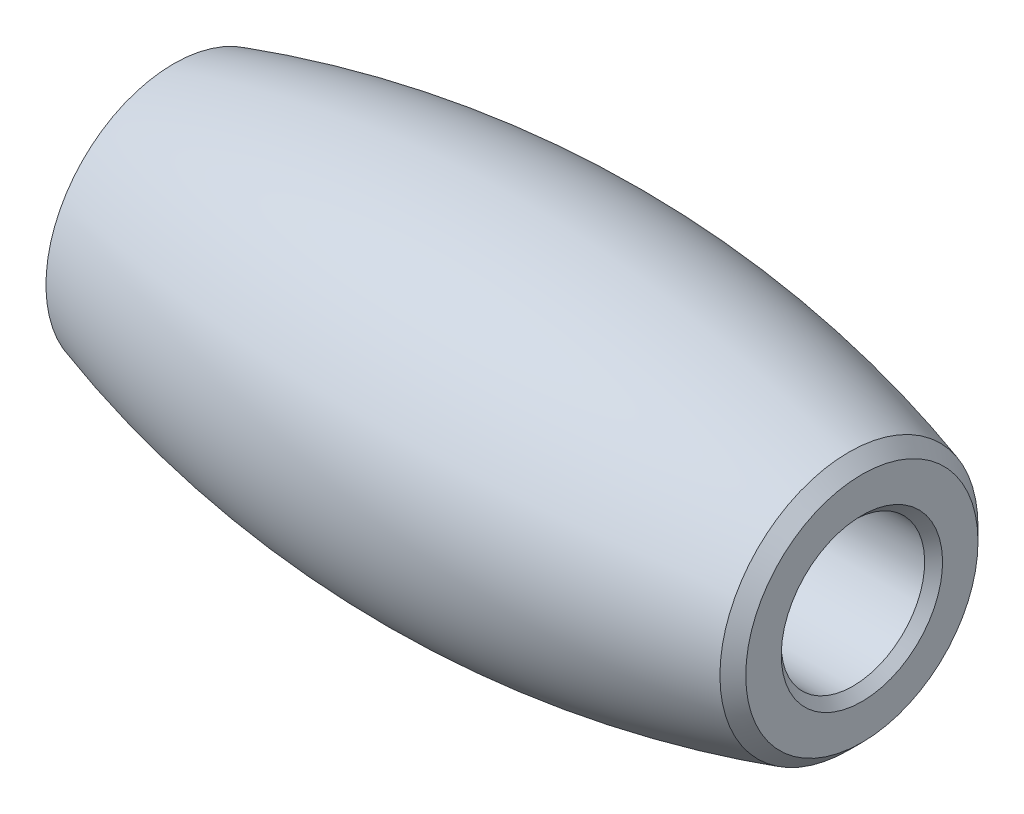
ISO-10303-21;
HEADER;
FILE_DESCRIPTION(('STEP AP214'),'2;1');
FILE_NAME('part.step','',(''),(''),'','','');
FILE_SCHEMA(('AUTOMOTIVE_DESIGN { 1 0 10303 214 1 1 1 1 }'));
ENDSEC;
DATA;
#1=APPLICATION_CONTEXT('core data for automotive mechanical design processes');
#2=APPLICATION_PROTOCOL_DEFINITION('international standard','automotive_design',2000,#1);
#3=PRODUCT_CONTEXT('',#1,'mechanical');
#4=PRODUCT('Part','Part','',(#3));
#5=PRODUCT_RELATED_PRODUCT_CATEGORY('part','',(#4));
#6=PRODUCT_DEFINITION_FORMATION('','',#4);
#7=PRODUCT_DEFINITION_CONTEXT('part definition',#1,'design');
#8=PRODUCT_DEFINITION('design','',#6,#7);
#9=PRODUCT_DEFINITION_SHAPE('','',#8);
#10=(LENGTH_UNIT() NAMED_UNIT(*) SI_UNIT(.MILLI.,.METRE.));
#11=(NAMED_UNIT(*) PLANE_ANGLE_UNIT() SI_UNIT($,.RADIAN.));
#12=(NAMED_UNIT(*) SI_UNIT($,.STERADIAN.) SOLID_ANGLE_UNIT());
#13=UNCERTAINTY_MEASURE_WITH_UNIT(LENGTH_MEASURE(1.E-05),#10,'distance_accuracy_value','');
#14=(GEOMETRIC_REPRESENTATION_CONTEXT(3) GLOBAL_UNCERTAINTY_ASSIGNED_CONTEXT((#13)) GLOBAL_UNIT_ASSIGNED_CONTEXT((#10,
#11,#12)) REPRESENTATION_CONTEXT('',''));
#15=CARTESIAN_POINT('',(0.,0.,0.));
#16=DIRECTION('',(0.,0.,1.));
#17=DIRECTION('',(1.,0.,0.));
#18=AXIS2_PLACEMENT_3D('',#15,#16,#17);
#19=CARTESIAN_POINT('',(0.,0.,0.));
#20=DIRECTION('',(-1.,0.,0.));
#21=DIRECTION('',(0.,-1.,0.));
#22=AXIS2_PLACEMENT_3D('',#19,#20,#21);
#23=DEGENERATE_TOROIDAL_SURFACE('',#22,54.875,64.875,.F.);
#24=CARTESIAN_POINT('',(18.7766734633694,0.,0.));
#25=DIRECTION('',(-1.,0.,0.));
#26=DIRECTION('',(0.,-1.,0.));
#27=AXIS2_PLACEMENT_3D('',#24,#25,#26);
#28=CIRCLE('',#27,7.22332653663058);
#29=CARTESIAN_POINT('',(18.7766734633694,-7.22332653663057,0.));
#30=VERTEX_POINT('',#29);
#31=EDGE_CURVE('E61',#30,#30,#28,.T.);
#32=ORIENTED_EDGE('',*,*,#31,.T.);
#33=EDGE_LOOP('',(#32));
#34=FACE_BOUND('',#33,.T.);
#35=CARTESIAN_POINT('',(-19.0243703323992,0.,0.));
#36=DIRECTION('',(1.,0.,0.));
#37=DIRECTION('',(0.,1.,0.));
#38=AXIS2_PLACEMENT_3D('',#35,#36,#37);
#39=CIRCLE('',#38,7.14789060061398);
#40=CARTESIAN_POINT('',(-19.0243703323992,7.14789060061399,0.));
#41=VERTEX_POINT('',#40);
#42=EDGE_CURVE('E64',#41,#41,#39,.T.);
#43=ORIENTED_EDGE('',*,*,#42,.T.);
#44=EDGE_LOOP('',(#43));
#45=FACE_BOUND('',#44,.T.);
#46=ADVANCED_FACE('F34',(#34,#45),#23,.F.);
#47=CARTESIAN_POINT('',(19.5,7.,0.));
#48=DIRECTION('',(-1.,0.,0.));
#49=DIRECTION('',(0.,-1.,0.));
#50=AXIS2_PLACEMENT_3D('',#47,#48,#49);
#51=PLANE('',#50);
#52=CARTESIAN_POINT('',(19.5,0.,0.));
#53=DIRECTION('',(-1.,0.,0.));
#54=DIRECTION('',(0.,-1.,0.));
#55=AXIS2_PLACEMENT_3D('',#52,#53,#54);
#56=CIRCLE('',#55,6.49999999999998);
#57=CARTESIAN_POINT('',(19.5,-6.49999999999997,0.));
#58=VERTEX_POINT('',#57);
#59=EDGE_CURVE('E55',#58,#58,#56,.F.);
#60=ORIENTED_EDGE('',*,*,#59,.T.);
#61=EDGE_LOOP('',(#60));
#62=FACE_BOUND('',#61,.T.);
#63=CARTESIAN_POINT('',(19.5,0.,0.));
#64=DIRECTION('',(-1.,0.,0.));
#65=DIRECTION('',(0.,-1.,0.));
#66=AXIS2_PLACEMENT_3D('',#63,#64,#65);
#67=CIRCLE('',#66,4.51499999999999);
#68=CARTESIAN_POINT('',(19.5,-4.51499999999999,0.));
#69=VERTEX_POINT('',#68);
#70=EDGE_CURVE('E58',#69,#69,#67,.T.);
#71=ORIENTED_EDGE('',*,*,#70,.T.);
#72=EDGE_LOOP('',(#71));
#73=FACE_BOUND('',#72,.T.);
#74=ADVANCED_FACE('F97',(#62,#73),#51,.F.);
#75=CARTESIAN_POINT('',(-19.5,0.,0.));
#76=DIRECTION('',(-1.,0.,0.));
#77=DIRECTION('',(0.,-1.,0.));
#78=AXIS2_PLACEMENT_3D('',#75,#76,#77);
#79=CYLINDRICAL_SURFACE('',#78,4.01499999999999);
#80=CARTESIAN_POINT('',(19.,0.,0.));
#81=DIRECTION('',(-1.,0.,0.));
#82=DIRECTION('',(0.,-1.,0.));
#83=AXIS2_PLACEMENT_3D('',#80,#81,#82);
#84=CIRCLE('',#83,4.01499999999999);
#85=CARTESIAN_POINT('',(19.,-4.01499999999999,0.));
#86=VERTEX_POINT('',#85);
#87=EDGE_CURVE('E10',#86,#86,#84,.F.);
#88=ORIENTED_EDGE('',*,*,#87,.T.);
#89=EDGE_LOOP('',(#88));
#90=FACE_BOUND('',#89,.T.);
#91=CARTESIAN_POINT('',(9.5,0.,0.));
#92=DIRECTION('',(-1.,0.,0.));
#93=DIRECTION('',(0.,-1.,0.));
#94=AXIS2_PLACEMENT_3D('',#91,#92,#93);
#95=CIRCLE('',#94,4.015);
#96=CARTESIAN_POINT('',(9.5,-4.01499999999999,0.));
#97=VERTEX_POINT('',#96);
#98=EDGE_CURVE('E67',#97,#97,#95,.T.);
#99=ORIENTED_EDGE('',*,*,#98,.T.);
#100=EDGE_LOOP('',(#99));
#101=FACE_BOUND('',#100,.T.);
#102=ADVANCED_FACE('F103',(#90,#101),#79,.F.);
#103=CARTESIAN_POINT('',(9.5,4.015,0.));
#104=DIRECTION('',(-1.,0.,0.));
#105=DIRECTION('',(0.,-1.,0.));
#106=AXIS2_PLACEMENT_3D('',#103,#104,#105);
#107=PLANE('',#106);
#108=ORIENTED_EDGE('',*,*,#98,.F.);
#109=EDGE_LOOP('',(#108));
#110=FACE_BOUND('',#109,.T.);
#111=CARTESIAN_POINT('',(9.5,0.,0.));
#112=DIRECTION('',(-1.,0.,0.));
#113=DIRECTION('',(0.,-1.,0.));
#114=AXIS2_PLACEMENT_3D('',#111,#112,#113);
#115=CIRCLE('',#114,3.);
#116=CARTESIAN_POINT('',(9.5,-2.99999999999999,0.));
#117=VERTEX_POINT('',#116);
#118=EDGE_CURVE('E70',#117,#117,#115,.T.);
#119=ORIENTED_EDGE('',*,*,#118,.T.);
#120=EDGE_LOOP('',(#119));
#121=FACE_BOUND('',#120,.T.);
#122=ADVANCED_FACE('F175',(#110,#121),#107,.F.);
#123=CARTESIAN_POINT('',(-19.5,0.,0.));
#124=DIRECTION('',(-1.,0.,0.));
#125=DIRECTION('',(0.,-1.,0.));
#126=AXIS2_PLACEMENT_3D('',#123,#124,#125);
#127=CYLINDRICAL_SURFACE('',#126,3.);
#128=ORIENTED_EDGE('',*,*,#118,.F.);
#129=EDGE_LOOP('',(#128));
#130=FACE_BOUND('',#129,.T.);
#131=CARTESIAN_POINT('',(-9.5,0.,0.));
#132=DIRECTION('',(-1.,0.,0.));
#133=DIRECTION('',(0.,-1.,0.));
#134=AXIS2_PLACEMENT_3D('',#131,#132,#133);
#135=CIRCLE('',#134,3.);
#136=CARTESIAN_POINT('',(-9.5,-3.,0.));
#137=VERTEX_POINT('',#136);
#138=EDGE_CURVE('E73',#137,#137,#135,.T.);
#139=ORIENTED_EDGE('',*,*,#138,.T.);
#140=EDGE_LOOP('',(#139));
#141=FACE_BOUND('',#140,.T.);
#142=ADVANCED_FACE('F93',(#130,#141),#127,.F.);
#143=CARTESIAN_POINT('',(-9.5,3.,0.));
#144=DIRECTION('',(1.,0.,0.));
#145=DIRECTION('',(0.,1.,0.));
#146=AXIS2_PLACEMENT_3D('',#143,#144,#145);
#147=PLANE('',#146);
#148=ORIENTED_EDGE('',*,*,#138,.F.);
#149=EDGE_LOOP('',(#148));
#150=FACE_BOUND('',#149,.T.);
#151=CARTESIAN_POINT('',(-9.5,0.,0.));
#152=DIRECTION('',(-1.,0.,0.));
#153=DIRECTION('',(0.,-1.,0.));
#154=AXIS2_PLACEMENT_3D('',#151,#152,#153);
#155=CIRCLE('',#154,4.015);
#156=CARTESIAN_POINT('',(-9.5,-4.015,0.));
#157=VERTEX_POINT('',#156);
#158=EDGE_CURVE('E76',#157,#157,#155,.T.);
#159=ORIENTED_EDGE('',*,*,#158,.T.);
#160=EDGE_LOOP('',(#159));
#161=FACE_BOUND('',#160,.T.);
#162=ADVANCED_FACE('F80',(#150,#161),#147,.F.);
#163=CARTESIAN_POINT('',(-19.5,0.,0.));
#164=DIRECTION('',(-1.,0.,0.));
#165=DIRECTION('',(0.,-1.,0.));
#166=AXIS2_PLACEMENT_3D('',#163,#164,#165);
#167=CYLINDRICAL_SURFACE('',#166,4.015);
#168=CARTESIAN_POINT('',(-19.,0.,0.));
#169=DIRECTION('',(1.,0.,0.));
#170=DIRECTION('',(0.,1.,0.));
#171=AXIS2_PLACEMENT_3D('',#168,#169,#170);
#172=CIRCLE('',#171,4.015);
#173=CARTESIAN_POINT('',(-19.,4.015,0.));
#174=VERTEX_POINT('',#173);
#175=EDGE_CURVE('E42',#174,#174,#172,.F.);
#176=ORIENTED_EDGE('',*,*,#175,.T.);
#177=EDGE_LOOP('',(#176));
#178=FACE_BOUND('',#177,.T.);
#179=ORIENTED_EDGE('',*,*,#158,.F.);
#180=EDGE_LOOP('',(#179));
#181=FACE_BOUND('',#180,.T.);
#182=ADVANCED_FACE('F82',(#178,#181),#167,.F.);
#183=CARTESIAN_POINT('',(-19.5,4.015,0.));
#184=DIRECTION('',(1.,0.,0.));
#185=DIRECTION('',(0.,1.,0.));
#186=AXIS2_PLACEMENT_3D('',#183,#184,#185);
#187=PLANE('',#186);
#188=CARTESIAN_POINT('',(-19.5,0.,0.));
#189=DIRECTION('',(1.,0.,0.));
#190=DIRECTION('',(0.,1.,0.));
#191=AXIS2_PLACEMENT_3D('',#188,#189,#190);
#192=CIRCLE('',#191,6.23451327433627);
#193=CARTESIAN_POINT('',(-19.5,6.23451327433627,0.));
#194=VERTEX_POINT('',#193);
#195=EDGE_CURVE('E46',#194,#194,#192,.F.);
#196=ORIENTED_EDGE('',*,*,#195,.T.);
#197=EDGE_LOOP('',(#196));
#198=FACE_BOUND('',#197,.T.);
#199=CARTESIAN_POINT('',(-19.5,0.,0.));
#200=DIRECTION('',(1.,0.,0.));
#201=DIRECTION('',(0.,1.,0.));
#202=AXIS2_PLACEMENT_3D('',#199,#200,#201);
#203=CIRCLE('',#202,4.515);
#204=CARTESIAN_POINT('',(-19.5,4.515,0.));
#205=VERTEX_POINT('',#204);
#206=EDGE_CURVE('E50',#205,#205,#203,.T.);
#207=ORIENTED_EDGE('',*,*,#206,.T.);
#208=EDGE_LOOP('',(#207));
#209=FACE_BOUND('',#208,.T.);
#210=ADVANCED_FACE('F84',(#198,#209),#187,.F.);
#211=CARTESIAN_POINT('',(18.7766734633694,0.,0.));
#212=DIRECTION('',(-1.,0.,0.));
#213=DIRECTION('',(0.,-1.,0.));
#214=AXIS2_PLACEMENT_3D('',#211,#212,#213);
#215=CONICAL_SURFACE('',#214,7.22332653663058,0.785398163397458);
#216=ORIENTED_EDGE('',*,*,#59,.F.);
#217=EDGE_LOOP('',(#216));
#218=FACE_BOUND('',#217,.T.);
#219=ORIENTED_EDGE('',*,*,#31,.F.);
#220=EDGE_LOOP('',(#219));
#221=FACE_BOUND('',#220,.T.);
#222=ADVANCED_FACE('F90',(#218,#221),#215,.T.);
#223=CARTESIAN_POINT('',(-19.5,0.,0.));
#224=DIRECTION('',(1.,0.,0.));
#225=DIRECTION('',(0.,1.,0.));
#226=AXIS2_PLACEMENT_3D('',#223,#224,#225);
#227=CONICAL_SURFACE('',#226,6.23451327433627,1.09069682018798);
#228=ORIENTED_EDGE('',*,*,#42,.F.);
#229=EDGE_LOOP('',(#228));
#230=FACE_BOUND('',#229,.T.);
#231=ORIENTED_EDGE('',*,*,#195,.F.);
#232=EDGE_LOOP('',(#231));
#233=FACE_BOUND('',#232,.T.);
#234=ADVANCED_FACE('F115',(#230,#233),#227,.T.);
#235=CARTESIAN_POINT('',(-19.,0.,0.));
#236=DIRECTION('',(-1.,0.,0.));
#237=DIRECTION('',(0.,-1.,0.));
#238=AXIS2_PLACEMENT_3D('',#235,#236,#237);
#239=CONICAL_SURFACE('',#238,4.015,0.785398163397449);
#240=ORIENTED_EDGE('',*,*,#206,.F.);
#241=EDGE_LOOP('',(#240));
#242=FACE_BOUND('',#241,.T.);
#243=ORIENTED_EDGE('',*,*,#175,.F.);
#244=EDGE_LOOP('',(#243));
#245=FACE_BOUND('',#244,.T.);
#246=ADVANCED_FACE('F121',(#242,#245),#239,.F.);
#247=CARTESIAN_POINT('',(19.5,0.,0.));
#248=DIRECTION('',(1.,0.,0.));
#249=DIRECTION('',(0.,1.,0.));
#250=AXIS2_PLACEMENT_3D('',#247,#248,#249);
#251=CONICAL_SURFACE('',#250,4.51499999999999,0.785398163397447);
#252=ORIENTED_EDGE('',*,*,#87,.F.);
#253=EDGE_LOOP('',(#252));
#254=FACE_BOUND('',#253,.T.);
#255=ORIENTED_EDGE('',*,*,#70,.F.);
#256=EDGE_LOOP('',(#255));
#257=FACE_BOUND('',#256,.T.);
#258=ADVANCED_FACE('F37',(#254,#257),#251,.F.);
#259=CLOSED_SHELL('',(#46,#74,#102,#122,#142,#162,#182,#210,#222,#234,#246,#258));
#260=MANIFOLD_SOLID_BREP('B2',#259);
#261=ADVANCED_BREP_SHAPE_REPRESENTATION('',(#18,#260),#14);
#262=SHAPE_DEFINITION_REPRESENTATION(#9,#261);
ENDSEC;
END-ISO-10303-21;
